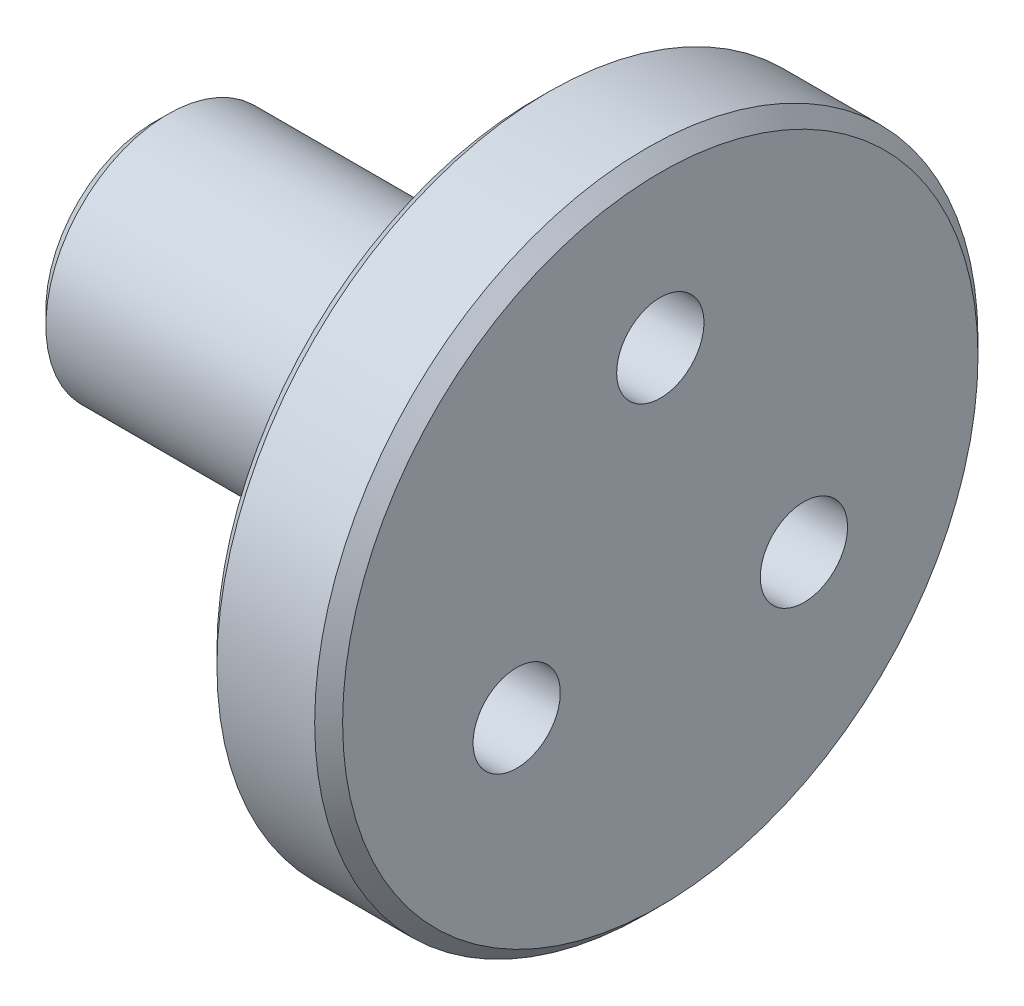
ISO-10303-21;
HEADER;
FILE_DESCRIPTION(('STEP AP214'),'2;1');
FILE_NAME('part.step','',(''),(''),'','','');
FILE_SCHEMA(('AUTOMOTIVE_DESIGN { 1 0 10303 214 1 1 1 1 }'));
ENDSEC;
DATA;
#1=APPLICATION_CONTEXT('core data for automotive mechanical design processes');
#2=APPLICATION_PROTOCOL_DEFINITION('international standard','automotive_design',2000,#1);
#3=PRODUCT_CONTEXT('',#1,'mechanical');
#4=PRODUCT('Part','Part','',(#3));
#5=PRODUCT_RELATED_PRODUCT_CATEGORY('part','',(#4));
#6=PRODUCT_DEFINITION_FORMATION('','',#4);
#7=PRODUCT_DEFINITION_CONTEXT('part definition',#1,'design');
#8=PRODUCT_DEFINITION('design','',#6,#7);
#9=PRODUCT_DEFINITION_SHAPE('','',#8);
#10=(LENGTH_UNIT() NAMED_UNIT(*) SI_UNIT(.MILLI.,.METRE.));
#11=(NAMED_UNIT(*) PLANE_ANGLE_UNIT() SI_UNIT($,.RADIAN.));
#12=(NAMED_UNIT(*) SI_UNIT($,.STERADIAN.) SOLID_ANGLE_UNIT());
#13=UNCERTAINTY_MEASURE_WITH_UNIT(LENGTH_MEASURE(1.E-05),#10,'distance_accuracy_value','');
#14=(GEOMETRIC_REPRESENTATION_CONTEXT(3) GLOBAL_UNCERTAINTY_ASSIGNED_CONTEXT((#13)) GLOBAL_UNIT_ASSIGNED_CONTEXT((#10,
#11,#12)) REPRESENTATION_CONTEXT('',''));
#15=CARTESIAN_POINT('',(0.,0.,0.));
#16=DIRECTION('',(0.,0.,1.));
#17=DIRECTION('',(1.,0.,0.));
#18=AXIS2_PLACEMENT_3D('',#15,#16,#17);
#19=CARTESIAN_POINT('',(0.,0.,0.));
#20=DIRECTION('',(-1.,0.,0.));
#21=DIRECTION('',(0.,0.,1.));
#22=AXIS2_PLACEMENT_3D('',#19,#20,#21);
#23=PLANE('',#22);
#24=CARTESIAN_POINT('',(0.,-2.37500000000002,4.11362066797607));
#25=DIRECTION('',(-1.,0.,0.));
#26=DIRECTION('',(0.,-0.866025403784436,-0.500000000000004));
#27=AXIS2_PLACEMENT_3D('',#24,#25,#26);
#28=CIRCLE('',#27,1.25);
#29=CARTESIAN_POINT('',(0.,-3.45753175473057,3.48862066797607));
#30=VERTEX_POINT('',#29);
#31=EDGE_CURVE('E82',#30,#30,#28,.T.);
#32=ORIENTED_EDGE('',*,*,#31,.T.);
#33=EDGE_LOOP('',(#32));
#34=FACE_BOUND('',#33,.T.);
#35=CARTESIAN_POINT('',(0.,-2.37499999999996,-4.1136206679761));
#36=DIRECTION('',(-1.,0.,0.));
#37=DIRECTION('',(0.,0.866025403784443,-0.499999999999992));
#38=AXIS2_PLACEMENT_3D('',#35,#36,#37);
#39=CIRCLE('',#38,1.25);
#40=CARTESIAN_POINT('',(0.,-1.29246824526941,-4.73862066797609));
#41=VERTEX_POINT('',#40);
#42=EDGE_CURVE('E233',#41,#41,#39,.T.);
#43=ORIENTED_EDGE('',*,*,#42,.T.);
#44=EDGE_LOOP('',(#43));
#45=FACE_BOUND('',#44,.T.);
#46=CARTESIAN_POINT('',(0.,0.,0.));
#47=DIRECTION('',(-1.,0.,0.));
#48=DIRECTION('',(0.,0.,1.));
#49=AXIS2_PLACEMENT_3D('',#46,#47,#48);
#50=CIRCLE('',#49,9.1);
#51=CARTESIAN_POINT('',(0.,0.,9.1));
#52=VERTEX_POINT('',#51);
#53=EDGE_CURVE('E51',#52,#52,#50,.F.);
#54=ORIENTED_EDGE('',*,*,#53,.T.);
#55=EDGE_LOOP('',(#54));
#56=FACE_BOUND('',#55,.T.);
#57=CARTESIAN_POINT('',(0.,4.75,0.));
#58=DIRECTION('',(-1.,0.,0.));
#59=DIRECTION('',(0.,0.,1.));
#60=AXIS2_PLACEMENT_3D('',#57,#58,#59);
#61=CIRCLE('',#60,1.25);
#62=CARTESIAN_POINT('',(0.,4.75,1.25));
#63=VERTEX_POINT('',#62);
#64=EDGE_CURVE('E77',#63,#63,#61,.T.);
#65=ORIENTED_EDGE('',*,*,#64,.T.);
#66=EDGE_LOOP('',(#65));
#67=FACE_BOUND('',#66,.T.);
#68=ADVANCED_FACE('F42',(#34,#45,#56,#67),#23,.F.);
#69=CARTESIAN_POINT('',(-14.5,0.,0.));
#70=DIRECTION('',(-1.,0.,0.));
#71=DIRECTION('',(0.,0.,1.));
#72=AXIS2_PLACEMENT_3D('',#69,#70,#71);
#73=CYLINDRICAL_SURFACE('',#72,9.5);
#74=CARTESIAN_POINT('',(-0.399999999999998,0.,0.));
#75=DIRECTION('',(-1.,0.,0.));
#76=DIRECTION('',(0.,0.,1.));
#77=AXIS2_PLACEMENT_3D('',#74,#75,#76);
#78=CIRCLE('',#77,9.5);
#79=CARTESIAN_POINT('',(-0.399999999999998,0.,9.5));
#80=VERTEX_POINT('',#79);
#81=EDGE_CURVE('E99',#80,#80,#78,.T.);
#82=ORIENTED_EDGE('',*,*,#81,.T.);
#83=EDGE_LOOP('',(#82));
#84=FACE_BOUND('',#83,.T.);
#85=CARTESIAN_POINT('',(-3.2,0.,0.));
#86=DIRECTION('',(1.,0.,0.));
#87=DIRECTION('',(0.,0.,-1.));
#88=AXIS2_PLACEMENT_3D('',#85,#86,#87);
#89=CIRCLE('',#88,9.5);
#90=CARTESIAN_POINT('',(-3.2,0.,-9.5));
#91=VERTEX_POINT('',#90);
#92=EDGE_CURVE('E96',#91,#91,#89,.T.);
#93=ORIENTED_EDGE('',*,*,#92,.T.);
#94=EDGE_LOOP('',(#93));
#95=FACE_BOUND('',#94,.T.);
#96=ADVANCED_FACE('F112',(#84,#95),#73,.T.);
#97=CARTESIAN_POINT('',(-3.6,9.5,0.));
#98=DIRECTION('',(1.,0.,0.));
#99=DIRECTION('',(0.,0.,-1.));
#100=AXIS2_PLACEMENT_3D('',#97,#98,#99);
#101=PLANE('',#100);
#102=CARTESIAN_POINT('',(-3.6,0.,0.));
#103=DIRECTION('',(1.,0.,0.));
#104=DIRECTION('',(0.,0.,-1.));
#105=AXIS2_PLACEMENT_3D('',#102,#103,#104);
#106=CIRCLE('',#105,9.1);
#107=CARTESIAN_POINT('',(-3.6,0.,-9.1));
#108=VERTEX_POINT('',#107);
#109=EDGE_CURVE('E11',#108,#108,#106,.F.);
#110=ORIENTED_EDGE('',*,*,#109,.T.);
#111=EDGE_LOOP('',(#110));
#112=FACE_BOUND('',#111,.T.);
#113=CARTESIAN_POINT('',(-3.6,0.,0.));
#114=DIRECTION('',(-1.,0.,0.));
#115=DIRECTION('',(0.,0.,1.));
#116=AXIS2_PLACEMENT_3D('',#113,#114,#115);
#117=CIRCLE('',#116,3.5);
#118=CARTESIAN_POINT('',(-3.6,-1.75000000000001,3.03108891324553));
#119=VERTEX_POINT('',#118);
#120=CARTESIAN_POINT('',(-3.6,3.5,0.));
#121=VERTEX_POINT('',#120);
#122=EDGE_CURVE('E68',#119,#121,#117,.T.);
#123=ORIENTED_EDGE('',*,*,#122,.F.);
#124=CARTESIAN_POINT('',(-3.6,-2.37500000000002,4.11362066797607));
#125=DIRECTION('',(-1.,0.,0.));
#126=DIRECTION('',(0.,-0.866025403784436,-0.500000000000004));
#127=AXIS2_PLACEMENT_3D('',#124,#125,#126);
#128=CIRCLE('',#127,1.25);
#129=EDGE_CURVE('E56',#119,#119,#128,.T.);
#130=ORIENTED_EDGE('',*,*,#129,.F.);
#131=CARTESIAN_POINT('',(-3.6,-1.74999999999997,-3.03108891324555));
#132=VERTEX_POINT('',#131);
#133=EDGE_CURVE('E74',#132,#119,#117,.T.);
#134=ORIENTED_EDGE('',*,*,#133,.F.);
#135=CARTESIAN_POINT('',(-3.6,-2.37499999999996,-4.1136206679761));
#136=DIRECTION('',(-1.,0.,0.));
#137=DIRECTION('',(0.,0.866025403784443,-0.499999999999992));
#138=AXIS2_PLACEMENT_3D('',#135,#136,#137);
#139=CIRCLE('',#138,1.25);
#140=EDGE_CURVE('E61',#132,#132,#139,.T.);
#141=ORIENTED_EDGE('',*,*,#140,.F.);
#142=EDGE_CURVE('E72',#121,#132,#117,.T.);
#143=ORIENTED_EDGE('',*,*,#142,.F.);
#144=CARTESIAN_POINT('',(-3.6,4.75,0.));
#145=DIRECTION('',(-1.,0.,0.));
#146=DIRECTION('',(0.,0.,1.));
#147=AXIS2_PLACEMENT_3D('',#144,#145,#146);
#148=CIRCLE('',#147,1.25);
#149=EDGE_CURVE('E80',#121,#121,#148,.T.);
#150=ORIENTED_EDGE('',*,*,#149,.F.);
#151=EDGE_LOOP('',(#123,#130,#134,#141,#143,#150));
#152=FACE_BOUND('',#151,.T.);
#153=ADVANCED_FACE('F115',(#112,#152),#101,.F.);
#154=CARTESIAN_POINT('',(-14.5,0.,0.));
#155=DIRECTION('',(-1.,0.,0.));
#156=DIRECTION('',(0.,0.,1.));
#157=AXIS2_PLACEMENT_3D('',#154,#155,#156);
#158=CYLINDRICAL_SURFACE('',#157,3.5);
#159=CARTESIAN_POINT('',(-14.1,0.,0.));
#160=DIRECTION('',(1.,0.,0.));
#161=DIRECTION('',(0.,0.,-1.));
#162=AXIS2_PLACEMENT_3D('',#159,#160,#161);
#163=CIRCLE('',#162,3.5);
#164=CARTESIAN_POINT('',(-14.1,0.,-3.5));
#165=VERTEX_POINT('',#164);
#166=EDGE_CURVE('E93',#165,#165,#163,.T.);
#167=ORIENTED_EDGE('',*,*,#166,.T.);
#168=EDGE_LOOP('',(#167));
#169=FACE_BOUND('',#168,.T.);
#170=ORIENTED_EDGE('',*,*,#142,.T.);
#171=ORIENTED_EDGE('',*,*,#133,.T.);
#172=ORIENTED_EDGE('',*,*,#122,.T.);
#173=EDGE_LOOP('',(#170,#171,#172));
#174=FACE_BOUND('',#173,.T.);
#175=ADVANCED_FACE('F70',(#169,#174),#158,.T.);
#176=CARTESIAN_POINT('',(-14.5,3.5,0.));
#177=DIRECTION('',(1.,0.,0.));
#178=DIRECTION('',(0.,0.,-1.));
#179=AXIS2_PLACEMENT_3D('',#176,#177,#178);
#180=PLANE('',#179);
#181=CARTESIAN_POINT('',(-14.5,0.,0.));
#182=DIRECTION('',(1.,0.,0.));
#183=DIRECTION('',(0.,0.,-1.));
#184=AXIS2_PLACEMENT_3D('',#181,#182,#183);
#185=CIRCLE('',#184,3.1);
#186=CARTESIAN_POINT('',(-14.5,0.,-3.1));
#187=VERTEX_POINT('',#186);
#188=EDGE_CURVE('E90',#187,#187,#185,.F.);
#189=ORIENTED_EDGE('',*,*,#188,.T.);
#190=EDGE_LOOP('',(#189));
#191=FACE_BOUND('',#190,.T.);
#192=ADVANCED_FACE('F129',(#191),#180,.F.);
#193=CARTESIAN_POINT('',(0.,4.75,0.));
#194=DIRECTION('',(-1.,0.,0.));
#195=DIRECTION('',(0.,0.,1.));
#196=AXIS2_PLACEMENT_3D('',#193,#194,#195);
#197=CYLINDRICAL_SURFACE('',#196,1.25);
#198=ORIENTED_EDGE('',*,*,#64,.F.);
#199=EDGE_LOOP('',(#198));
#200=FACE_BOUND('',#199,.T.);
#201=ORIENTED_EDGE('',*,*,#149,.T.);
#202=EDGE_LOOP('',(#201));
#203=FACE_BOUND('',#202,.T.);
#204=ADVANCED_FACE('F81',(#200,#203),#197,.F.);
#205=CARTESIAN_POINT('',(-14.5,0.,0.));
#206=DIRECTION('',(1.,0.,0.));
#207=DIRECTION('',(0.,0.,-1.));
#208=AXIS2_PLACEMENT_3D('',#205,#206,#207);
#209=CONICAL_SURFACE('',#208,3.1,0.785398163397446);
#210=ORIENTED_EDGE('',*,*,#166,.F.);
#211=EDGE_LOOP('',(#210));
#212=FACE_BOUND('',#211,.T.);
#213=ORIENTED_EDGE('',*,*,#188,.F.);
#214=EDGE_LOOP('',(#213));
#215=FACE_BOUND('',#214,.T.);
#216=ADVANCED_FACE('F109',(#212,#215),#209,.T.);
#217=CARTESIAN_POINT('',(-0.399999999999998,0.,0.));
#218=DIRECTION('',(-1.,0.,0.));
#219=DIRECTION('',(0.,0.,1.));
#220=AXIS2_PLACEMENT_3D('',#217,#218,#219);
#221=CONICAL_SURFACE('',#220,9.5,0.785398163397453);
#222=ORIENTED_EDGE('',*,*,#53,.F.);
#223=EDGE_LOOP('',(#222));
#224=FACE_BOUND('',#223,.T.);
#225=ORIENTED_EDGE('',*,*,#81,.F.);
#226=EDGE_LOOP('',(#225));
#227=FACE_BOUND('',#226,.T.);
#228=ADVANCED_FACE('F106',(#224,#227),#221,.T.);
#229=CARTESIAN_POINT('',(-3.6,0.,0.));
#230=DIRECTION('',(1.,0.,0.));
#231=DIRECTION('',(0.,0.,-1.));
#232=AXIS2_PLACEMENT_3D('',#229,#230,#231);
#233=CONICAL_SURFACE('',#232,9.1,0.785398163397446);
#234=ORIENTED_EDGE('',*,*,#92,.F.);
#235=EDGE_LOOP('',(#234));
#236=FACE_BOUND('',#235,.T.);
#237=ORIENTED_EDGE('',*,*,#109,.F.);
#238=EDGE_LOOP('',(#237));
#239=FACE_BOUND('',#238,.T.);
#240=ADVANCED_FACE('F45',(#236,#239),#233,.T.);
#241=CARTESIAN_POINT('',(0.,-2.37499999999996,-4.1136206679761));
#242=DIRECTION('',(-1.,0.,0.));
#243=DIRECTION('',(0.,0.,1.));
#244=AXIS2_PLACEMENT_3D('',#241,#242,#243);
#245=CYLINDRICAL_SURFACE('',#244,1.25);
#246=ORIENTED_EDGE('',*,*,#42,.F.);
#247=EDGE_LOOP('',(#246));
#248=FACE_BOUND('',#247,.T.);
#249=ORIENTED_EDGE('',*,*,#140,.T.);
#250=EDGE_LOOP('',(#249));
#251=FACE_BOUND('',#250,.T.);
#252=ADVANCED_FACE('F121',(#248,#251),#245,.F.);
#253=CARTESIAN_POINT('',(0.,-2.37500000000002,4.11362066797607));
#254=DIRECTION('',(-1.,0.,0.));
#255=DIRECTION('',(0.,0.,1.));
#256=AXIS2_PLACEMENT_3D('',#253,#254,#255);
#257=CYLINDRICAL_SURFACE('',#256,1.25);
#258=ORIENTED_EDGE('',*,*,#31,.F.);
#259=EDGE_LOOP('',(#258));
#260=FACE_BOUND('',#259,.T.);
#261=ORIENTED_EDGE('',*,*,#129,.T.);
#262=EDGE_LOOP('',(#261));
#263=FACE_BOUND('',#262,.T.);
#264=ADVANCED_FACE('F165',(#260,#263),#257,.F.);
#265=CLOSED_SHELL('',(#68,#96,#153,#175,#192,#204,#216,#228,#240,#252,#264));
#266=MANIFOLD_SOLID_BREP('B2',#265);
#267=ADVANCED_BREP_SHAPE_REPRESENTATION('',(#18,#266),#14);
#268=SHAPE_DEFINITION_REPRESENTATION(#9,#267);
ENDSEC;
END-ISO-10303-21;
